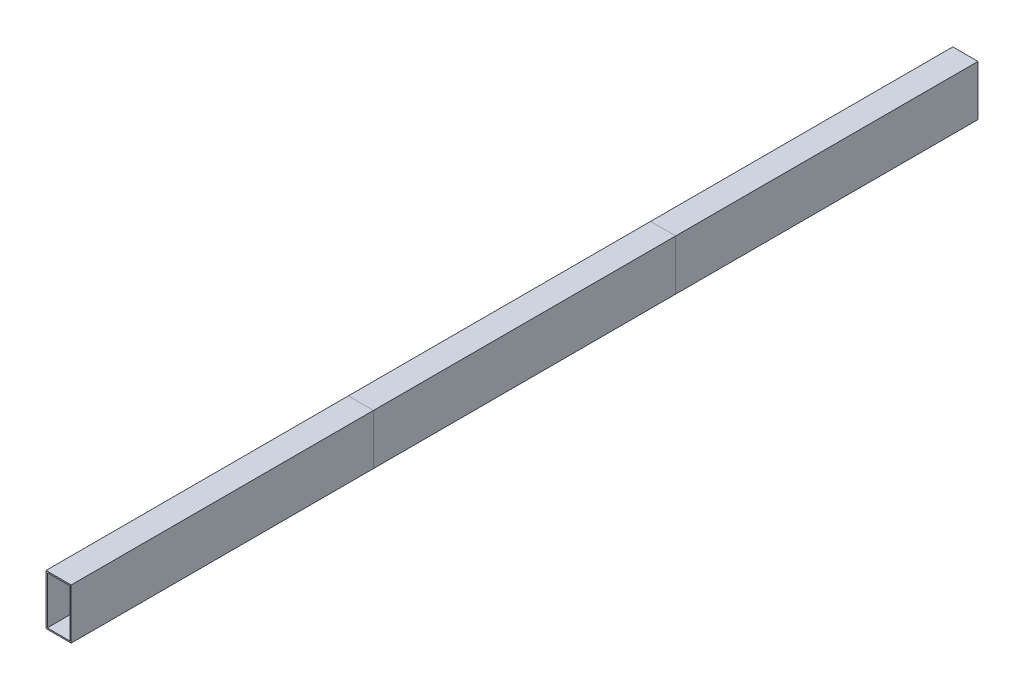
ISO-10303-21;
HEADER;
FILE_DESCRIPTION(('STEP AP214'),'2;1');
FILE_NAME('part.step','',(''),(''),'','','');
FILE_SCHEMA(('AUTOMOTIVE_DESIGN { 1 0 10303 214 1 1 1 1 }'));
ENDSEC;
DATA;
#1=APPLICATION_CONTEXT('core data for automotive mechanical design processes');
#2=APPLICATION_PROTOCOL_DEFINITION('international standard','automotive_design',2000,#1);
#3=PRODUCT_CONTEXT('',#1,'mechanical');
#4=PRODUCT('Part','Part','',(#3));
#5=PRODUCT_RELATED_PRODUCT_CATEGORY('part','',(#4));
#6=PRODUCT_DEFINITION_FORMATION('','',#4);
#7=PRODUCT_DEFINITION_CONTEXT('part definition',#1,'design');
#8=PRODUCT_DEFINITION('design','',#6,#7);
#9=PRODUCT_DEFINITION_SHAPE('','',#8);
#10=(LENGTH_UNIT() NAMED_UNIT(*) SI_UNIT(.MILLI.,.METRE.));
#11=(NAMED_UNIT(*) PLANE_ANGLE_UNIT() SI_UNIT($,.RADIAN.));
#12=(NAMED_UNIT(*) SI_UNIT($,.STERADIAN.) SOLID_ANGLE_UNIT());
#13=UNCERTAINTY_MEASURE_WITH_UNIT(LENGTH_MEASURE(1.E-05),#10,'distance_accuracy_value','');
#14=(GEOMETRIC_REPRESENTATION_CONTEXT(3) GLOBAL_UNCERTAINTY_ASSIGNED_CONTEXT((#13)) GLOBAL_UNIT_ASSIGNED_CONTEXT((#10,
#11,#12)) REPRESENTATION_CONTEXT('',''));
#15=CARTESIAN_POINT('',(0.,0.,0.));
#16=DIRECTION('',(0.,0.,1.));
#17=DIRECTION('',(1.,0.,0.));
#18=AXIS2_PLACEMENT_3D('',#15,#16,#17);
#19=CARTESIAN_POINT('',(-50.,0.,3600.));
#20=DIRECTION('',(-1.,0.,0.));
#21=DIRECTION('',(0.,0.,1.));
#22=AXIS2_PLACEMENT_3D('',#19,#20,#21);
#23=PLANE('',#22);
#24=DIRECTION('',(0.,1.,0.));
#25=VECTOR('',#24,1.);
#26=CARTESIAN_POINT('',(-50.,0.,2400.));
#27=LINE('',#26,#25);
#28=CARTESIAN_POINT('',(-50.,-100.,2400.));
#29=VERTEX_POINT('',#28);
#30=CARTESIAN_POINT('',(-50.,100.,2400.));
#31=VERTEX_POINT('',#30);
#32=EDGE_CURVE('E150',#29,#31,#27,.T.);
#33=ORIENTED_EDGE('',*,*,#32,.F.);
#34=DIRECTION('',(0.,0.,-1.));
#35=VECTOR('',#34,1.);
#36=CARTESIAN_POINT('',(-50.,-100.,3600.));
#37=LINE('',#36,#35);
#38=CARTESIAN_POINT('',(-50.,-100.,3600.));
#39=VERTEX_POINT('',#38);
#40=EDGE_CURVE('E13',#39,#29,#37,.T.);
#41=ORIENTED_EDGE('',*,*,#40,.F.);
#42=DIRECTION('',(0.,1.,0.));
#43=VECTOR('',#42,1.);
#44=CARTESIAN_POINT('',(-50.,0.,3600.));
#45=LINE('',#44,#43);
#46=CARTESIAN_POINT('',(-50.,100.,3600.));
#47=VERTEX_POINT('',#46);
#48=EDGE_CURVE('E154',#39,#47,#45,.T.);
#49=ORIENTED_EDGE('',*,*,#48,.T.);
#50=DIRECTION('',(0.,0.,-1.));
#51=VECTOR('',#50,1.);
#52=CARTESIAN_POINT('',(-50.,100.,3600.));
#53=LINE('',#52,#51);
#54=EDGE_CURVE('E54',#47,#31,#53,.T.);
#55=ORIENTED_EDGE('',*,*,#54,.T.);
#56=EDGE_LOOP('',(#33,#41,#49,#55));
#57=FACE_BOUND('',#56,.T.);
#58=ADVANCED_FACE('F51',(#57),#23,.T.);
#59=CARTESIAN_POINT('',(0.,-100.,3600.));
#60=DIRECTION('',(0.,-1.,0.));
#61=DIRECTION('',(0.,0.,-1.));
#62=AXIS2_PLACEMENT_3D('',#59,#60,#61);
#63=PLANE('',#62);
#64=DIRECTION('',(-1.,0.,0.));
#65=VECTOR('',#64,1.);
#66=CARTESIAN_POINT('',(0.,-100.,2400.));
#67=LINE('',#66,#65);
#68=CARTESIAN_POINT('',(50.,-100.,2400.));
#69=VERTEX_POINT('',#68);
#70=EDGE_CURVE('E158',#69,#29,#67,.T.);
#71=ORIENTED_EDGE('',*,*,#70,.F.);
#72=DIRECTION('',(0.,0.,-1.));
#73=VECTOR('',#72,1.);
#74=CARTESIAN_POINT('',(50.,-100.,3600.));
#75=LINE('',#74,#73);
#76=CARTESIAN_POINT('',(50.,-100.,3600.));
#77=VERTEX_POINT('',#76);
#78=EDGE_CURVE('E60',#77,#69,#75,.T.);
#79=ORIENTED_EDGE('',*,*,#78,.F.);
#80=DIRECTION('',(-1.,0.,0.));
#81=VECTOR('',#80,1.);
#82=CARTESIAN_POINT('',(0.,-100.,3600.));
#83=LINE('',#82,#81);
#84=EDGE_CURVE('E165',#77,#39,#83,.T.);
#85=ORIENTED_EDGE('',*,*,#84,.T.);
#86=ORIENTED_EDGE('',*,*,#40,.T.);
#87=EDGE_LOOP('',(#71,#79,#85,#86));
#88=FACE_BOUND('',#87,.T.);
#89=ADVANCED_FACE('F191',(#88),#63,.T.);
#90=CARTESIAN_POINT('',(50.,0.,3600.));
#91=DIRECTION('',(1.,0.,0.));
#92=DIRECTION('',(0.,0.,-1.));
#93=AXIS2_PLACEMENT_3D('',#90,#91,#92);
#94=PLANE('',#93);
#95=DIRECTION('',(0.,-1.,0.));
#96=VECTOR('',#95,1.);
#97=CARTESIAN_POINT('',(50.,0.,2400.));
#98=LINE('',#97,#96);
#99=CARTESIAN_POINT('',(50.,100.,2400.));
#100=VERTEX_POINT('',#99);
#101=EDGE_CURVE('E173',#100,#69,#98,.T.);
#102=ORIENTED_EDGE('',*,*,#101,.F.);
#103=DIRECTION('',(0.,0.,-1.));
#104=VECTOR('',#103,1.);
#105=CARTESIAN_POINT('',(50.,100.,3600.));
#106=LINE('',#105,#104);
#107=CARTESIAN_POINT('',(50.,100.,3600.));
#108=VERTEX_POINT('',#107);
#109=EDGE_CURVE('E178',#108,#100,#106,.T.);
#110=ORIENTED_EDGE('',*,*,#109,.F.);
#111=DIRECTION('',(0.,-1.,0.));
#112=VECTOR('',#111,1.);
#113=CARTESIAN_POINT('',(50.,0.,3600.));
#114=LINE('',#113,#112);
#115=EDGE_CURVE('E162',#108,#77,#114,.T.);
#116=ORIENTED_EDGE('',*,*,#115,.T.);
#117=ORIENTED_EDGE('',*,*,#78,.T.);
#118=EDGE_LOOP('',(#102,#110,#116,#117));
#119=FACE_BOUND('',#118,.T.);
#120=ADVANCED_FACE('F195',(#119),#94,.T.);
#121=CARTESIAN_POINT('',(0.,100.,3600.));
#122=DIRECTION('',(0.,1.,0.));
#123=DIRECTION('',(0.,0.,1.));
#124=AXIS2_PLACEMENT_3D('',#121,#122,#123);
#125=PLANE('',#124);
#126=DIRECTION('',(1.,0.,0.));
#127=VECTOR('',#126,1.);
#128=CARTESIAN_POINT('',(0.,100.,2400.));
#129=LINE('',#128,#127);
#130=EDGE_CURVE('E170',#31,#100,#129,.T.);
#131=ORIENTED_EDGE('',*,*,#130,.F.);
#132=ORIENTED_EDGE('',*,*,#54,.F.);
#133=DIRECTION('',(1.,0.,0.));
#134=VECTOR('',#133,1.);
#135=CARTESIAN_POINT('',(0.,100.,3600.));
#136=LINE('',#135,#134);
#137=EDGE_CURVE('E157',#47,#108,#136,.T.);
#138=ORIENTED_EDGE('',*,*,#137,.T.);
#139=ORIENTED_EDGE('',*,*,#109,.T.);
#140=EDGE_LOOP('',(#131,#132,#138,#139));
#141=FACE_BOUND('',#140,.T.);
#142=ADVANCED_FACE('F186',(#141),#125,.T.);
#143=CARTESIAN_POINT('',(0.,0.,3600.));
#144=DIRECTION('',(0.,0.,-1.));
#145=DIRECTION('',(-1.,0.,0.));
#146=AXIS2_PLACEMENT_3D('',#143,#144,#145);
#147=PLANE('',#146);
#148=DIRECTION('',(-1.,0.,0.));
#149=VECTOR('',#148,1.);
#150=CARTESIAN_POINT('',(0.,-95.,3600.));
#151=LINE('',#150,#149);
#152=CARTESIAN_POINT('',(45.,-95.,3600.));
#153=VERTEX_POINT('',#152);
#154=CARTESIAN_POINT('',(-45.,-95.,3600.));
#155=VERTEX_POINT('',#154);
#156=EDGE_CURVE('E125',#153,#155,#151,.T.);
#157=ORIENTED_EDGE('',*,*,#156,.T.);
#158=DIRECTION('',(0.,1.,0.));
#159=VECTOR('',#158,1.);
#160=CARTESIAN_POINT('',(-45.,0.,3600.));
#161=LINE('',#160,#159);
#162=CARTESIAN_POINT('',(-45.,95.,3600.));
#163=VERTEX_POINT('',#162);
#164=EDGE_CURVE('E119',#155,#163,#161,.T.);
#165=ORIENTED_EDGE('',*,*,#164,.T.);
#166=DIRECTION('',(1.,0.,0.));
#167=VECTOR('',#166,1.);
#168=CARTESIAN_POINT('',(0.,95.,3600.));
#169=LINE('',#168,#167);
#170=CARTESIAN_POINT('',(45.,95.,3600.));
#171=VERTEX_POINT('',#170);
#172=EDGE_CURVE('E128',#163,#171,#169,.T.);
#173=ORIENTED_EDGE('',*,*,#172,.T.);
#174=DIRECTION('',(0.,-1.,0.));
#175=VECTOR('',#174,1.);
#176=CARTESIAN_POINT('',(45.,0.,3600.));
#177=LINE('',#176,#175);
#178=EDGE_CURVE('E68',#171,#153,#177,.T.);
#179=ORIENTED_EDGE('',*,*,#178,.T.);
#180=EDGE_LOOP('',(#157,#165,#173,#179));
#181=FACE_BOUND('',#180,.T.);
#182=ORIENTED_EDGE('',*,*,#48,.F.);
#183=ORIENTED_EDGE('',*,*,#84,.F.);
#184=ORIENTED_EDGE('',*,*,#115,.F.);
#185=ORIENTED_EDGE('',*,*,#137,.F.);
#186=EDGE_LOOP('',(#182,#183,#184,#185));
#187=FACE_BOUND('',#186,.T.);
#188=ADVANCED_FACE('F132',(#181,#187),#147,.F.);
#189=CARTESIAN_POINT('',(0.,0.,2400.));
#190=DIRECTION('',(0.,0.,-1.));
#191=DIRECTION('',(-1.,0.,0.));
#192=AXIS2_PLACEMENT_3D('',#189,#190,#191);
#193=PLANE('',#192);
#194=DIRECTION('',(0.,1.,0.));
#195=VECTOR('',#194,1.);
#196=CARTESIAN_POINT('',(-45.,0.,2400.));
#197=LINE('',#196,#195);
#198=CARTESIAN_POINT('',(-45.,-95.,2400.));
#199=VERTEX_POINT('',#198);
#200=CARTESIAN_POINT('',(-45.,95.,2400.));
#201=VERTEX_POINT('',#200);
#202=EDGE_CURVE('E76',#199,#201,#197,.T.);
#203=ORIENTED_EDGE('',*,*,#202,.F.);
#204=DIRECTION('',(-1.,0.,0.));
#205=VECTOR('',#204,1.);
#206=CARTESIAN_POINT('',(0.,-95.,2400.));
#207=LINE('',#206,#205);
#208=CARTESIAN_POINT('',(45.,-95.,2400.));
#209=VERTEX_POINT('',#208);
#210=EDGE_CURVE('E135',#209,#199,#207,.T.);
#211=ORIENTED_EDGE('',*,*,#210,.F.);
#212=DIRECTION('',(0.,-1.,0.));
#213=VECTOR('',#212,1.);
#214=CARTESIAN_POINT('',(45.,0.,2400.));
#215=LINE('',#214,#213);
#216=CARTESIAN_POINT('',(45.,95.,2400.));
#217=VERTEX_POINT('',#216);
#218=EDGE_CURVE('E138',#217,#209,#215,.T.);
#219=ORIENTED_EDGE('',*,*,#218,.F.);
#220=DIRECTION('',(1.,0.,0.));
#221=VECTOR('',#220,1.);
#222=CARTESIAN_POINT('',(0.,95.,2400.));
#223=LINE('',#222,#221);
#224=EDGE_CURVE('E144',#201,#217,#223,.T.);
#225=ORIENTED_EDGE('',*,*,#224,.F.);
#226=EDGE_LOOP('',(#203,#211,#219,#225));
#227=FACE_BOUND('',#226,.T.);
#228=ORIENTED_EDGE('',*,*,#32,.T.);
#229=ORIENTED_EDGE('',*,*,#130,.T.);
#230=ORIENTED_EDGE('',*,*,#101,.T.);
#231=ORIENTED_EDGE('',*,*,#70,.T.);
#232=EDGE_LOOP('',(#228,#229,#230,#231));
#233=FACE_BOUND('',#232,.T.);
#234=ADVANCED_FACE('F188',(#227,#233),#193,.T.);
#235=CARTESIAN_POINT('',(-45.,0.,3600.));
#236=DIRECTION('',(-1.,0.,0.));
#237=DIRECTION('',(0.,0.,1.));
#238=AXIS2_PLACEMENT_3D('',#235,#236,#237);
#239=PLANE('',#238);
#240=ORIENTED_EDGE('',*,*,#202,.T.);
#241=DIRECTION('',(0.,0.,-1.));
#242=VECTOR('',#241,1.);
#243=CARTESIAN_POINT('',(-45.,95.,3600.));
#244=LINE('',#243,#242);
#245=EDGE_CURVE('E115',#163,#201,#244,.T.);
#246=ORIENTED_EDGE('',*,*,#245,.F.);
#247=ORIENTED_EDGE('',*,*,#164,.F.);
#248=DIRECTION('',(0.,0.,-1.));
#249=VECTOR('',#248,1.);
#250=CARTESIAN_POINT('',(-45.,-95.,3600.));
#251=LINE('',#250,#249);
#252=EDGE_CURVE('E148',#155,#199,#251,.T.);
#253=ORIENTED_EDGE('',*,*,#252,.T.);
#254=EDGE_LOOP('',(#240,#246,#247,#253));
#255=FACE_BOUND('',#254,.T.);
#256=ADVANCED_FACE('F117',(#255),#239,.F.);
#257=CARTESIAN_POINT('',(0.,-95.,3600.));
#258=DIRECTION('',(0.,-1.,0.));
#259=DIRECTION('',(0.,0.,-1.));
#260=AXIS2_PLACEMENT_3D('',#257,#258,#259);
#261=PLANE('',#260);
#262=ORIENTED_EDGE('',*,*,#210,.T.);
#263=ORIENTED_EDGE('',*,*,#252,.F.);
#264=ORIENTED_EDGE('',*,*,#156,.F.);
#265=DIRECTION('',(0.,0.,-1.));
#266=VECTOR('',#265,1.);
#267=CARTESIAN_POINT('',(45.,-95.,3600.));
#268=LINE('',#267,#266);
#269=EDGE_CURVE('E151',#153,#209,#268,.T.);
#270=ORIENTED_EDGE('',*,*,#269,.T.);
#271=EDGE_LOOP('',(#262,#263,#264,#270));
#272=FACE_BOUND('',#271,.T.);
#273=ADVANCED_FACE('F246',(#272),#261,.F.);
#274=CARTESIAN_POINT('',(45.,0.,3600.));
#275=DIRECTION('',(1.,0.,0.));
#276=DIRECTION('',(0.,0.,-1.));
#277=AXIS2_PLACEMENT_3D('',#274,#275,#276);
#278=PLANE('',#277);
#279=ORIENTED_EDGE('',*,*,#218,.T.);
#280=ORIENTED_EDGE('',*,*,#269,.F.);
#281=ORIENTED_EDGE('',*,*,#178,.F.);
#282=DIRECTION('',(0.,0.,-1.));
#283=VECTOR('',#282,1.);
#284=CARTESIAN_POINT('',(45.,95.,3600.));
#285=LINE('',#284,#283);
#286=EDGE_CURVE('E124',#171,#217,#285,.T.);
#287=ORIENTED_EDGE('',*,*,#286,.T.);
#288=EDGE_LOOP('',(#279,#280,#281,#287));
#289=FACE_BOUND('',#288,.T.);
#290=ADVANCED_FACE('F255',(#289),#278,.F.);
#291=CARTESIAN_POINT('',(0.,95.,3600.));
#292=DIRECTION('',(0.,1.,0.));
#293=DIRECTION('',(0.,0.,1.));
#294=AXIS2_PLACEMENT_3D('',#291,#292,#293);
#295=PLANE('',#294);
#296=ORIENTED_EDGE('',*,*,#224,.T.);
#297=ORIENTED_EDGE('',*,*,#286,.F.);
#298=ORIENTED_EDGE('',*,*,#172,.F.);
#299=ORIENTED_EDGE('',*,*,#245,.T.);
#300=EDGE_LOOP('',(#296,#297,#298,#299));
#301=FACE_BOUND('',#300,.T.);
#302=ADVANCED_FACE('F129',(#301),#295,.F.);
#303=CLOSED_SHELL('',(#58,#89,#120,#142,#188,#234,#256,#273,#290,#302));
#304=MANIFOLD_SOLID_BREP('B2',#303);
#305=CARTESIAN_POINT('',(0.,0.,2400.));
#306=DIRECTION('',(0.,0.,1.));
#307=DIRECTION('',(1.,0.,0.));
#308=AXIS2_PLACEMENT_3D('',#305,#306,#307);
#309=PLANE('',#308);
#310=DIRECTION('',(0.,1.,0.));
#311=VECTOR('',#310,1.);
#312=CARTESIAN_POINT('',(50.,0.,2400.));
#313=LINE('',#312,#311);
#314=CARTESIAN_POINT('',(50.,-100.,2400.));
#315=VERTEX_POINT('',#314);
#316=CARTESIAN_POINT('',(50.,100.,2400.));
#317=VERTEX_POINT('',#316);
#318=EDGE_CURVE('E393',#315,#317,#313,.T.);
#319=ORIENTED_EDGE('',*,*,#318,.T.);
#320=DIRECTION('',(-1.,0.,0.));
#321=VECTOR('',#320,1.);
#322=CARTESIAN_POINT('',(0.,100.,2400.));
#323=LINE('',#322,#321);
#324=CARTESIAN_POINT('',(-50.,100.,2400.));
#325=VERTEX_POINT('',#324);
#326=EDGE_CURVE('E396',#317,#325,#323,.T.);
#327=ORIENTED_EDGE('',*,*,#326,.T.);
#328=DIRECTION('',(0.,-1.,0.));
#329=VECTOR('',#328,1.);
#330=CARTESIAN_POINT('',(-50.,0.,2400.));
#331=LINE('',#330,#329);
#332=CARTESIAN_POINT('',(-50.,-100.,2400.));
#333=VERTEX_POINT('',#332);
#334=EDGE_CURVE('E399',#325,#333,#331,.T.);
#335=ORIENTED_EDGE('',*,*,#334,.T.);
#336=DIRECTION('',(1.,0.,0.));
#337=VECTOR('',#336,1.);
#338=CARTESIAN_POINT('',(0.,-100.,2400.));
#339=LINE('',#338,#337);
#340=EDGE_CURVE('E401',#333,#315,#339,.T.);
#341=ORIENTED_EDGE('',*,*,#340,.T.);
#342=EDGE_LOOP('',(#319,#327,#335,#341));
#343=FACE_BOUND('',#342,.T.);
#344=DIRECTION('',(-1.,0.,0.));
#345=VECTOR('',#344,1.);
#346=CARTESIAN_POINT('',(0.,95.,2400.));
#347=LINE('',#346,#345);
#348=CARTESIAN_POINT('',(45.,95.,2400.));
#349=VERTEX_POINT('',#348);
#350=CARTESIAN_POINT('',(-45.,95.,2400.));
#351=VERTEX_POINT('',#350);
#352=EDGE_CURVE('E365',#349,#351,#347,.T.);
#353=ORIENTED_EDGE('',*,*,#352,.F.);
#354=DIRECTION('',(0.,1.,0.));
#355=VECTOR('',#354,1.);
#356=CARTESIAN_POINT('',(45.,0.,2400.));
#357=LINE('',#356,#355);
#358=CARTESIAN_POINT('',(45.,-95.,2400.));
#359=VERTEX_POINT('',#358);
#360=EDGE_CURVE('E357',#359,#349,#357,.T.);
#361=ORIENTED_EDGE('',*,*,#360,.F.);
#362=DIRECTION('',(1.,0.,0.));
#363=VECTOR('',#362,1.);
#364=CARTESIAN_POINT('',(0.,-95.,2400.));
#365=LINE('',#364,#363);
#366=CARTESIAN_POINT('',(-45.,-95.,2400.));
#367=VERTEX_POINT('',#366);
#368=EDGE_CURVE('E379',#367,#359,#365,.T.);
#369=ORIENTED_EDGE('',*,*,#368,.F.);
#370=DIRECTION('',(0.,-1.,0.));
#371=VECTOR('',#370,1.);
#372=CARTESIAN_POINT('',(-45.,0.,2400.));
#373=LINE('',#372,#371);
#374=EDGE_CURVE('E377',#351,#367,#373,.T.);
#375=ORIENTED_EDGE('',*,*,#374,.F.);
#376=EDGE_LOOP('',(#353,#361,#369,#375));
#377=FACE_BOUND('',#376,.T.);
#378=ADVANCED_FACE('F292',(#343,#377),#309,.T.);
#379=CARTESIAN_POINT('',(0.,0.,1200.));
#380=DIRECTION('',(0.,0.,1.));
#381=DIRECTION('',(1.,0.,0.));
#382=AXIS2_PLACEMENT_3D('',#379,#380,#381);
#383=PLANE('',#382);
#384=DIRECTION('',(0.,1.,0.));
#385=VECTOR('',#384,1.);
#386=CARTESIAN_POINT('',(50.,0.,1200.));
#387=LINE('',#386,#385);
#388=CARTESIAN_POINT('',(50.,-100.,1200.));
#389=VERTEX_POINT('',#388);
#390=CARTESIAN_POINT('',(50.,100.,1200.));
#391=VERTEX_POINT('',#390);
#392=EDGE_CURVE('E373',#389,#391,#387,.T.);
#393=ORIENTED_EDGE('',*,*,#392,.F.);
#394=DIRECTION('',(1.,0.,0.));
#395=VECTOR('',#394,1.);
#396=CARTESIAN_POINT('',(0.,-100.,1200.));
#397=LINE('',#396,#395);
#398=CARTESIAN_POINT('',(-50.,-100.,1200.));
#399=VERTEX_POINT('',#398);
#400=EDGE_CURVE('E397',#399,#389,#397,.T.);
#401=ORIENTED_EDGE('',*,*,#400,.F.);
#402=DIRECTION('',(0.,-1.,0.));
#403=VECTOR('',#402,1.);
#404=CARTESIAN_POINT('',(-50.,0.,1200.));
#405=LINE('',#404,#403);
#406=CARTESIAN_POINT('',(-50.,100.,1200.));
#407=VERTEX_POINT('',#406);
#408=EDGE_CURVE('E408',#407,#399,#405,.T.);
#409=ORIENTED_EDGE('',*,*,#408,.F.);
#410=DIRECTION('',(-1.,0.,0.));
#411=VECTOR('',#410,1.);
#412=CARTESIAN_POINT('',(0.,100.,1200.));
#413=LINE('',#412,#411);
#414=EDGE_CURVE('E406',#391,#407,#413,.T.);
#415=ORIENTED_EDGE('',*,*,#414,.F.);
#416=EDGE_LOOP('',(#393,#401,#409,#415));
#417=FACE_BOUND('',#416,.T.);
#418=DIRECTION('',(0.,1.,0.));
#419=VECTOR('',#418,1.);
#420=CARTESIAN_POINT('',(45.,0.,1200.));
#421=LINE('',#420,#419);
#422=CARTESIAN_POINT('',(45.,-95.,1200.));
#423=VERTEX_POINT('',#422);
#424=CARTESIAN_POINT('',(45.,95.,1200.));
#425=VERTEX_POINT('',#424);
#426=EDGE_CURVE('E315',#423,#425,#421,.T.);
#427=ORIENTED_EDGE('',*,*,#426,.T.);
#428=DIRECTION('',(-1.,0.,0.));
#429=VECTOR('',#428,1.);
#430=CARTESIAN_POINT('',(0.,95.,1200.));
#431=LINE('',#430,#429);
#432=CARTESIAN_POINT('',(-45.,95.,1200.));
#433=VERTEX_POINT('',#432);
#434=EDGE_CURVE('E372',#425,#433,#431,.T.);
#435=ORIENTED_EDGE('',*,*,#434,.T.);
#436=DIRECTION('',(0.,-1.,0.));
#437=VECTOR('',#436,1.);
#438=CARTESIAN_POINT('',(-45.,0.,1200.));
#439=LINE('',#438,#437);
#440=CARTESIAN_POINT('',(-45.,-95.,1200.));
#441=VERTEX_POINT('',#440);
#442=EDGE_CURVE('E385',#433,#441,#439,.T.);
#443=ORIENTED_EDGE('',*,*,#442,.T.);
#444=DIRECTION('',(1.,0.,0.));
#445=VECTOR('',#444,1.);
#446=CARTESIAN_POINT('',(0.,-95.,1200.));
#447=LINE('',#446,#445);
#448=EDGE_CURVE('E366',#441,#423,#447,.T.);
#449=ORIENTED_EDGE('',*,*,#448,.T.);
#450=EDGE_LOOP('',(#427,#435,#443,#449));
#451=FACE_BOUND('',#450,.T.);
#452=ADVANCED_FACE('F426',(#417,#451),#383,.F.);
#453=CARTESIAN_POINT('',(50.,0.,2400.));
#454=DIRECTION('',(-1.,0.,0.));
#455=DIRECTION('',(0.,0.,1.));
#456=AXIS2_PLACEMENT_3D('',#453,#454,#455);
#457=PLANE('',#456);
#458=ORIENTED_EDGE('',*,*,#392,.T.);
#459=DIRECTION('',(0.,0.,-1.));
#460=VECTOR('',#459,1.);
#461=CARTESIAN_POINT('',(50.,100.,2400.));
#462=LINE('',#461,#460);
#463=EDGE_CURVE('E49',#317,#391,#462,.T.);
#464=ORIENTED_EDGE('',*,*,#463,.F.);
#465=ORIENTED_EDGE('',*,*,#318,.F.);
#466=DIRECTION('',(0.,0.,-1.));
#467=VECTOR('',#466,1.);
#468=CARTESIAN_POINT('',(50.,-100.,2400.));
#469=LINE('',#468,#467);
#470=EDGE_CURVE('E403',#315,#389,#469,.T.);
#471=ORIENTED_EDGE('',*,*,#470,.T.);
#472=EDGE_LOOP('',(#458,#464,#465,#471));
#473=FACE_BOUND('',#472,.T.);
#474=ADVANCED_FACE('F294',(#473),#457,.F.);
#475=CARTESIAN_POINT('',(0.,100.,2400.));
#476=DIRECTION('',(0.,-1.,0.));
#477=DIRECTION('',(0.,0.,-1.));
#478=AXIS2_PLACEMENT_3D('',#475,#476,#477);
#479=PLANE('',#478);
#480=ORIENTED_EDGE('',*,*,#414,.T.);
#481=DIRECTION('',(0.,0.,-1.));
#482=VECTOR('',#481,1.);
#483=CARTESIAN_POINT('',(-50.,100.,2400.));
#484=LINE('',#483,#482);
#485=EDGE_CURVE('E300',#325,#407,#484,.T.);
#486=ORIENTED_EDGE('',*,*,#485,.F.);
#487=ORIENTED_EDGE('',*,*,#326,.F.);
#488=ORIENTED_EDGE('',*,*,#463,.T.);
#489=EDGE_LOOP('',(#480,#486,#487,#488));
#490=FACE_BOUND('',#489,.T.);
#491=ADVANCED_FACE('F436',(#490),#479,.F.);
#492=CARTESIAN_POINT('',(-50.,0.,2400.));
#493=DIRECTION('',(1.,0.,0.));
#494=DIRECTION('',(0.,0.,-1.));
#495=AXIS2_PLACEMENT_3D('',#492,#493,#494);
#496=PLANE('',#495);
#497=ORIENTED_EDGE('',*,*,#408,.T.);
#498=DIRECTION('',(0.,0.,-1.));
#499=VECTOR('',#498,1.);
#500=CARTESIAN_POINT('',(-50.,-100.,2400.));
#501=LINE('',#500,#499);
#502=EDGE_CURVE('E413',#333,#399,#501,.T.);
#503=ORIENTED_EDGE('',*,*,#502,.F.);
#504=ORIENTED_EDGE('',*,*,#334,.F.);
#505=ORIENTED_EDGE('',*,*,#485,.T.);
#506=EDGE_LOOP('',(#497,#503,#504,#505));
#507=FACE_BOUND('',#506,.T.);
#508=ADVANCED_FACE('F420',(#507),#496,.F.);
#509=CARTESIAN_POINT('',(0.,-100.,2400.));
#510=DIRECTION('',(0.,1.,0.));
#511=DIRECTION('',(0.,0.,1.));
#512=AXIS2_PLACEMENT_3D('',#509,#510,#511);
#513=PLANE('',#512);
#514=ORIENTED_EDGE('',*,*,#400,.T.);
#515=ORIENTED_EDGE('',*,*,#470,.F.);
#516=ORIENTED_EDGE('',*,*,#340,.F.);
#517=ORIENTED_EDGE('',*,*,#502,.T.);
#518=EDGE_LOOP('',(#514,#515,#516,#517));
#519=FACE_BOUND('',#518,.T.);
#520=ADVANCED_FACE('F430',(#519),#513,.F.);
#521=CARTESIAN_POINT('',(45.,0.,2400.));
#522=DIRECTION('',(-1.,0.,0.));
#523=DIRECTION('',(0.,0.,1.));
#524=AXIS2_PLACEMENT_3D('',#521,#522,#523);
#525=PLANE('',#524);
#526=ORIENTED_EDGE('',*,*,#426,.F.);
#527=DIRECTION('',(0.,0.,-1.));
#528=VECTOR('',#527,1.);
#529=CARTESIAN_POINT('',(45.,-95.,2400.));
#530=LINE('',#529,#528);
#531=EDGE_CURVE('E361',#359,#423,#530,.T.);
#532=ORIENTED_EDGE('',*,*,#531,.F.);
#533=ORIENTED_EDGE('',*,*,#360,.T.);
#534=DIRECTION('',(0.,0.,-1.));
#535=VECTOR('',#534,1.);
#536=CARTESIAN_POINT('',(45.,95.,2400.));
#537=LINE('',#536,#535);
#538=EDGE_CURVE('E360',#349,#425,#537,.T.);
#539=ORIENTED_EDGE('',*,*,#538,.T.);
#540=EDGE_LOOP('',(#526,#532,#533,#539));
#541=FACE_BOUND('',#540,.T.);
#542=ADVANCED_FACE('F359',(#541),#525,.T.);
#543=CARTESIAN_POINT('',(0.,95.,2400.));
#544=DIRECTION('',(0.,-1.,0.));
#545=DIRECTION('',(0.,0.,-1.));
#546=AXIS2_PLACEMENT_3D('',#543,#544,#545);
#547=PLANE('',#546);
#548=ORIENTED_EDGE('',*,*,#434,.F.);
#549=ORIENTED_EDGE('',*,*,#538,.F.);
#550=ORIENTED_EDGE('',*,*,#352,.T.);
#551=DIRECTION('',(0.,0.,-1.));
#552=VECTOR('',#551,1.);
#553=CARTESIAN_POINT('',(-45.,95.,2400.));
#554=LINE('',#553,#552);
#555=EDGE_CURVE('E374',#351,#433,#554,.T.);
#556=ORIENTED_EDGE('',*,*,#555,.T.);
#557=EDGE_LOOP('',(#548,#549,#550,#556));
#558=FACE_BOUND('',#557,.T.);
#559=ADVANCED_FACE('F369',(#558),#547,.T.);
#560=CARTESIAN_POINT('',(-45.,0.,2400.));
#561=DIRECTION('',(1.,0.,0.));
#562=DIRECTION('',(0.,0.,-1.));
#563=AXIS2_PLACEMENT_3D('',#560,#561,#562);
#564=PLANE('',#563);
#565=ORIENTED_EDGE('',*,*,#442,.F.);
#566=ORIENTED_EDGE('',*,*,#555,.F.);
#567=ORIENTED_EDGE('',*,*,#374,.T.);
#568=DIRECTION('',(0.,0.,-1.));
#569=VECTOR('',#568,1.);
#570=CARTESIAN_POINT('',(-45.,-95.,2400.));
#571=LINE('',#570,#569);
#572=EDGE_CURVE('E307',#367,#441,#571,.T.);
#573=ORIENTED_EDGE('',*,*,#572,.T.);
#574=EDGE_LOOP('',(#565,#566,#567,#573));
#575=FACE_BOUND('',#574,.T.);
#576=ADVANCED_FACE('F459',(#575),#564,.T.);
#577=CARTESIAN_POINT('',(0.,-95.,2400.));
#578=DIRECTION('',(0.,1.,0.));
#579=DIRECTION('',(0.,0.,1.));
#580=AXIS2_PLACEMENT_3D('',#577,#578,#579);
#581=PLANE('',#580);
#582=ORIENTED_EDGE('',*,*,#448,.F.);
#583=ORIENTED_EDGE('',*,*,#572,.F.);
#584=ORIENTED_EDGE('',*,*,#368,.T.);
#585=ORIENTED_EDGE('',*,*,#531,.T.);
#586=EDGE_LOOP('',(#582,#583,#584,#585));
#587=FACE_BOUND('',#586,.T.);
#588=ADVANCED_FACE('F463',(#587),#581,.T.);
#589=CLOSED_SHELL('',(#378,#452,#474,#491,#508,#520,#542,#559,#576,#588));
#590=MANIFOLD_SOLID_BREP('B7',#589);
#591=CARTESIAN_POINT('',(0.,0.,1200.));
#592=DIRECTION('',(0.,0.,-1.));
#593=DIRECTION('',(-1.,0.,0.));
#594=AXIS2_PLACEMENT_3D('',#591,#592,#593);
#595=PLANE('',#594);
#596=DIRECTION('',(0.,1.,0.));
#597=VECTOR('',#596,1.);
#598=CARTESIAN_POINT('',(50.,-100.,1200.));
#599=LINE('',#598,#597);
#600=CARTESIAN_POINT('',(50.,-100.,1200.));
#601=VERTEX_POINT('',#600);
#602=CARTESIAN_POINT('',(50.,100.,1200.));
#603=VERTEX_POINT('',#602);
#604=EDGE_CURVE('E624',#601,#603,#599,.T.);
#605=ORIENTED_EDGE('',*,*,#604,.T.);
#606=DIRECTION('',(-1.,0.,0.));
#607=VECTOR('',#606,1.);
#608=CARTESIAN_POINT('',(-50.,100.,1200.));
#609=LINE('',#608,#607);
#610=CARTESIAN_POINT('',(-50.,100.,1200.));
#611=VERTEX_POINT('',#610);
#612=EDGE_CURVE('E627',#603,#611,#609,.T.);
#613=ORIENTED_EDGE('',*,*,#612,.T.);
#614=DIRECTION('',(0.,-1.,0.));
#615=VECTOR('',#614,1.);
#616=CARTESIAN_POINT('',(-50.,-100.,1200.));
#617=LINE('',#616,#615);
#618=CARTESIAN_POINT('',(-50.,-100.,1200.));
#619=VERTEX_POINT('',#618);
#620=EDGE_CURVE('E630',#611,#619,#617,.T.);
#621=ORIENTED_EDGE('',*,*,#620,.T.);
#622=DIRECTION('',(1.,0.,0.));
#623=VECTOR('',#622,1.);
#624=CARTESIAN_POINT('',(-50.,-100.,1200.));
#625=LINE('',#624,#623);
#626=EDGE_CURVE('E632',#619,#601,#625,.T.);
#627=ORIENTED_EDGE('',*,*,#626,.T.);
#628=EDGE_LOOP('',(#605,#613,#621,#627));
#629=FACE_BOUND('',#628,.T.);
#630=DIRECTION('',(0.,1.,0.));
#631=VECTOR('',#630,1.);
#632=CARTESIAN_POINT('',(45.,-95.,1200.));
#633=LINE('',#632,#631);
#634=CARTESIAN_POINT('',(45.,-95.,1200.));
#635=VERTEX_POINT('',#634);
#636=CARTESIAN_POINT('',(45.,95.,1200.));
#637=VERTEX_POINT('',#636);
#638=EDGE_CURVE('E588',#635,#637,#633,.T.);
#639=ORIENTED_EDGE('',*,*,#638,.F.);
#640=DIRECTION('',(1.,0.,0.));
#641=VECTOR('',#640,1.);
#642=CARTESIAN_POINT('',(-45.,-95.,1200.));
#643=LINE('',#642,#641);
#644=CARTESIAN_POINT('',(-45.,-95.,1200.));
#645=VERTEX_POINT('',#644);
#646=EDGE_CURVE('E610',#645,#635,#643,.T.);
#647=ORIENTED_EDGE('',*,*,#646,.F.);
#648=DIRECTION('',(0.,-1.,0.));
#649=VECTOR('',#648,1.);
#650=CARTESIAN_POINT('',(-45.,-95.,1200.));
#651=LINE('',#650,#649);
#652=CARTESIAN_POINT('',(-45.,95.,1200.));
#653=VERTEX_POINT('',#652);
#654=EDGE_CURVE('E608',#653,#645,#651,.T.);
#655=ORIENTED_EDGE('',*,*,#654,.F.);
#656=DIRECTION('',(-1.,0.,0.));
#657=VECTOR('',#656,1.);
#658=CARTESIAN_POINT('',(-45.,95.,1200.));
#659=LINE('',#658,#657);
#660=EDGE_CURVE('E596',#637,#653,#659,.T.);
#661=ORIENTED_EDGE('',*,*,#660,.F.);
#662=EDGE_LOOP('',(#639,#647,#655,#661));
#663=FACE_BOUND('',#662,.T.);
#664=ADVANCED_FACE('F523',(#629,#663),#595,.F.);
#665=CARTESIAN_POINT('',(0.,0.,0.));
#666=DIRECTION('',(0.,0.,-1.));
#667=DIRECTION('',(-1.,0.,0.));
#668=AXIS2_PLACEMENT_3D('',#665,#666,#667);
#669=PLANE('',#668);
#670=DIRECTION('',(0.,1.,0.));
#671=VECTOR('',#670,1.);
#672=CARTESIAN_POINT('',(50.,-100.,0.));
#673=LINE('',#672,#671);
#674=CARTESIAN_POINT('',(50.,-100.,0.));
#675=VERTEX_POINT('',#674);
#676=CARTESIAN_POINT('',(50.,100.,0.));
#677=VERTEX_POINT('',#676);
#678=EDGE_CURVE('E604',#675,#677,#673,.T.);
#679=ORIENTED_EDGE('',*,*,#678,.F.);
#680=DIRECTION('',(1.,0.,0.));
#681=VECTOR('',#680,1.);
#682=CARTESIAN_POINT('',(-50.,-100.,0.));
#683=LINE('',#682,#681);
#684=CARTESIAN_POINT('',(-50.,-100.,0.));
#685=VERTEX_POINT('',#684);
#686=EDGE_CURVE('E628',#685,#675,#683,.T.);
#687=ORIENTED_EDGE('',*,*,#686,.F.);
#688=DIRECTION('',(0.,-1.,0.));
#689=VECTOR('',#688,1.);
#690=CARTESIAN_POINT('',(-50.,-100.,0.));
#691=LINE('',#690,#689);
#692=CARTESIAN_POINT('',(-50.,100.,0.));
#693=VERTEX_POINT('',#692);
#694=EDGE_CURVE('E640',#693,#685,#691,.T.);
#695=ORIENTED_EDGE('',*,*,#694,.F.);
#696=DIRECTION('',(-1.,0.,0.));
#697=VECTOR('',#696,1.);
#698=CARTESIAN_POINT('',(-50.,100.,0.));
#699=LINE('',#698,#697);
#700=EDGE_CURVE('E638',#677,#693,#699,.T.);
#701=ORIENTED_EDGE('',*,*,#700,.F.);
#702=EDGE_LOOP('',(#679,#687,#695,#701));
#703=FACE_BOUND('',#702,.T.);
#704=DIRECTION('',(1.,0.,0.));
#705=VECTOR('',#704,1.);
#706=CARTESIAN_POINT('',(-45.,-95.,0.));
#707=LINE('',#706,#705);
#708=CARTESIAN_POINT('',(-45.,-95.,0.));
#709=VERTEX_POINT('',#708);
#710=CARTESIAN_POINT('',(45.,-95.,0.));
#711=VERTEX_POINT('',#710);
#712=EDGE_CURVE('E597',#709,#711,#707,.T.);
#713=ORIENTED_EDGE('',*,*,#712,.T.);
#714=DIRECTION('',(0.,1.,0.));
#715=VECTOR('',#714,1.);
#716=CARTESIAN_POINT('',(45.,-95.,0.));
#717=LINE('',#716,#715);
#718=CARTESIAN_POINT('',(45.,95.,0.));
#719=VERTEX_POINT('',#718);
#720=EDGE_CURVE('E546',#711,#719,#717,.T.);
#721=ORIENTED_EDGE('',*,*,#720,.T.);
#722=DIRECTION('',(-1.,0.,0.));
#723=VECTOR('',#722,1.);
#724=CARTESIAN_POINT('',(-45.,95.,0.));
#725=LINE('',#724,#723);
#726=CARTESIAN_POINT('',(-45.,95.,0.));
#727=VERTEX_POINT('',#726);
#728=EDGE_CURVE('E603',#719,#727,#725,.T.);
#729=ORIENTED_EDGE('',*,*,#728,.T.);
#730=DIRECTION('',(0.,-1.,0.));
#731=VECTOR('',#730,1.);
#732=CARTESIAN_POINT('',(-45.,-95.,0.));
#733=LINE('',#732,#731);
#734=EDGE_CURVE('E616',#727,#709,#733,.T.);
#735=ORIENTED_EDGE('',*,*,#734,.T.);
#736=EDGE_LOOP('',(#713,#721,#729,#735));
#737=FACE_BOUND('',#736,.T.);
#738=ADVANCED_FACE('F658',(#703,#737),#669,.T.);
#739=CARTESIAN_POINT('',(50.,-100.,1200.));
#740=DIRECTION('',(-1.,0.,0.));
#741=DIRECTION('',(0.,0.,1.));
#742=AXIS2_PLACEMENT_3D('',#739,#740,#741);
#743=PLANE('',#742);
#744=ORIENTED_EDGE('',*,*,#678,.T.);
#745=DIRECTION('',(0.,0.,-1.));
#746=VECTOR('',#745,1.);
#747=CARTESIAN_POINT('',(50.,100.,1200.));
#748=LINE('',#747,#746);
#749=EDGE_CURVE('E290',#603,#677,#748,.T.);
#750=ORIENTED_EDGE('',*,*,#749,.F.);
#751=ORIENTED_EDGE('',*,*,#604,.F.);
#752=DIRECTION('',(0.,0.,-1.));
#753=VECTOR('',#752,1.);
#754=CARTESIAN_POINT('',(50.,-100.,1200.));
#755=LINE('',#754,#753);
#756=EDGE_CURVE('E634',#601,#675,#755,.T.);
#757=ORIENTED_EDGE('',*,*,#756,.T.);
#758=EDGE_LOOP('',(#744,#750,#751,#757));
#759=FACE_BOUND('',#758,.T.);
#760=ADVANCED_FACE('F525',(#759),#743,.F.);
#761=CARTESIAN_POINT('',(-50.,100.,1200.));
#762=DIRECTION('',(0.,-1.,0.));
#763=DIRECTION('',(0.,0.,-1.));
#764=AXIS2_PLACEMENT_3D('',#761,#762,#763);
#765=PLANE('',#764);
#766=ORIENTED_EDGE('',*,*,#700,.T.);
#767=DIRECTION('',(0.,0.,-1.));
#768=VECTOR('',#767,1.);
#769=CARTESIAN_POINT('',(-50.,100.,1200.));
#770=LINE('',#769,#768);
#771=EDGE_CURVE('E531',#611,#693,#770,.T.);
#772=ORIENTED_EDGE('',*,*,#771,.F.);
#773=ORIENTED_EDGE('',*,*,#612,.F.);
#774=ORIENTED_EDGE('',*,*,#749,.T.);
#775=EDGE_LOOP('',(#766,#772,#773,#774));
#776=FACE_BOUND('',#775,.T.);
#777=ADVANCED_FACE('F668',(#776),#765,.F.);
#778=CARTESIAN_POINT('',(-50.,-100.,1200.));
#779=DIRECTION('',(1.,0.,0.));
#780=DIRECTION('',(0.,0.,-1.));
#781=AXIS2_PLACEMENT_3D('',#778,#779,#780);
#782=PLANE('',#781);
#783=ORIENTED_EDGE('',*,*,#694,.T.);
#784=DIRECTION('',(0.,0.,-1.));
#785=VECTOR('',#784,1.);
#786=CARTESIAN_POINT('',(-50.,-100.,1200.));
#787=LINE('',#786,#785);
#788=EDGE_CURVE('E645',#619,#685,#787,.T.);
#789=ORIENTED_EDGE('',*,*,#788,.F.);
#790=ORIENTED_EDGE('',*,*,#620,.F.);
#791=ORIENTED_EDGE('',*,*,#771,.T.);
#792=EDGE_LOOP('',(#783,#789,#790,#791));
#793=FACE_BOUND('',#792,.T.);
#794=ADVANCED_FACE('F652',(#793),#782,.F.);
#795=CARTESIAN_POINT('',(-50.,-100.,1200.));
#796=DIRECTION('',(0.,1.,0.));
#797=DIRECTION('',(0.,0.,1.));
#798=AXIS2_PLACEMENT_3D('',#795,#796,#797);
#799=PLANE('',#798);
#800=ORIENTED_EDGE('',*,*,#686,.T.);
#801=ORIENTED_EDGE('',*,*,#756,.F.);
#802=ORIENTED_EDGE('',*,*,#626,.F.);
#803=ORIENTED_EDGE('',*,*,#788,.T.);
#804=EDGE_LOOP('',(#800,#801,#802,#803));
#805=FACE_BOUND('',#804,.T.);
#806=ADVANCED_FACE('F662',(#805),#799,.F.);
#807=CARTESIAN_POINT('',(45.,-95.,1200.));
#808=DIRECTION('',(-1.,0.,0.));
#809=DIRECTION('',(0.,0.,1.));
#810=AXIS2_PLACEMENT_3D('',#807,#808,#809);
#811=PLANE('',#810);
#812=ORIENTED_EDGE('',*,*,#720,.F.);
#813=DIRECTION('',(0.,0.,-1.));
#814=VECTOR('',#813,1.);
#815=CARTESIAN_POINT('',(45.,-95.,1200.));
#816=LINE('',#815,#814);
#817=EDGE_CURVE('E592',#635,#711,#816,.T.);
#818=ORIENTED_EDGE('',*,*,#817,.F.);
#819=ORIENTED_EDGE('',*,*,#638,.T.);
#820=DIRECTION('',(0.,0.,-1.));
#821=VECTOR('',#820,1.);
#822=CARTESIAN_POINT('',(45.,95.,1200.));
#823=LINE('',#822,#821);
#824=EDGE_CURVE('E591',#637,#719,#823,.T.);
#825=ORIENTED_EDGE('',*,*,#824,.T.);
#826=EDGE_LOOP('',(#812,#818,#819,#825));
#827=FACE_BOUND('',#826,.T.);
#828=ADVANCED_FACE('F590',(#827),#811,.T.);
#829=CARTESIAN_POINT('',(-45.,95.,1200.));
#830=DIRECTION('',(0.,-1.,0.));
#831=DIRECTION('',(0.,0.,-1.));
#832=AXIS2_PLACEMENT_3D('',#829,#830,#831);
#833=PLANE('',#832);
#834=ORIENTED_EDGE('',*,*,#728,.F.);
#835=ORIENTED_EDGE('',*,*,#824,.F.);
#836=ORIENTED_EDGE('',*,*,#660,.T.);
#837=DIRECTION('',(0.,0.,-1.));
#838=VECTOR('',#837,1.);
#839=CARTESIAN_POINT('',(-45.,95.,1200.));
#840=LINE('',#839,#838);
#841=EDGE_CURVE('E605',#653,#727,#840,.T.);
#842=ORIENTED_EDGE('',*,*,#841,.T.);
#843=EDGE_LOOP('',(#834,#835,#836,#842));
#844=FACE_BOUND('',#843,.T.);
#845=ADVANCED_FACE('F600',(#844),#833,.T.);
#846=CARTESIAN_POINT('',(-45.,-95.,1200.));
#847=DIRECTION('',(1.,0.,0.));
#848=DIRECTION('',(0.,0.,-1.));
#849=AXIS2_PLACEMENT_3D('',#846,#847,#848);
#850=PLANE('',#849);
#851=ORIENTED_EDGE('',*,*,#734,.F.);
#852=ORIENTED_EDGE('',*,*,#841,.F.);
#853=ORIENTED_EDGE('',*,*,#654,.T.);
#854=DIRECTION('',(0.,0.,-1.));
#855=VECTOR('',#854,1.);
#856=CARTESIAN_POINT('',(-45.,-95.,1200.));
#857=LINE('',#856,#855);
#858=EDGE_CURVE('E538',#645,#709,#857,.T.);
#859=ORIENTED_EDGE('',*,*,#858,.T.);
#860=EDGE_LOOP('',(#851,#852,#853,#859));
#861=FACE_BOUND('',#860,.T.);
#862=ADVANCED_FACE('F691',(#861),#850,.T.);
#863=CARTESIAN_POINT('',(-45.,-95.,1200.));
#864=DIRECTION('',(0.,1.,0.));
#865=DIRECTION('',(0.,0.,1.));
#866=AXIS2_PLACEMENT_3D('',#863,#864,#865);
#867=PLANE('',#866);
#868=ORIENTED_EDGE('',*,*,#712,.F.);
#869=ORIENTED_EDGE('',*,*,#858,.F.);
#870=ORIENTED_EDGE('',*,*,#646,.T.);
#871=ORIENTED_EDGE('',*,*,#817,.T.);
#872=EDGE_LOOP('',(#868,#869,#870,#871));
#873=FACE_BOUND('',#872,.T.);
#874=ADVANCED_FACE('F695',(#873),#867,.T.);
#875=CLOSED_SHELL('',(#664,#738,#760,#777,#794,#806,#828,#845,#862,#874));
#876=MANIFOLD_SOLID_BREP('B43',#875);
#877=ADVANCED_BREP_SHAPE_REPRESENTATION('',(#18,#304,#590,#876),#14);
#878=SHAPE_DEFINITION_REPRESENTATION(#9,#877);
ENDSEC;
END-ISO-10303-21;
